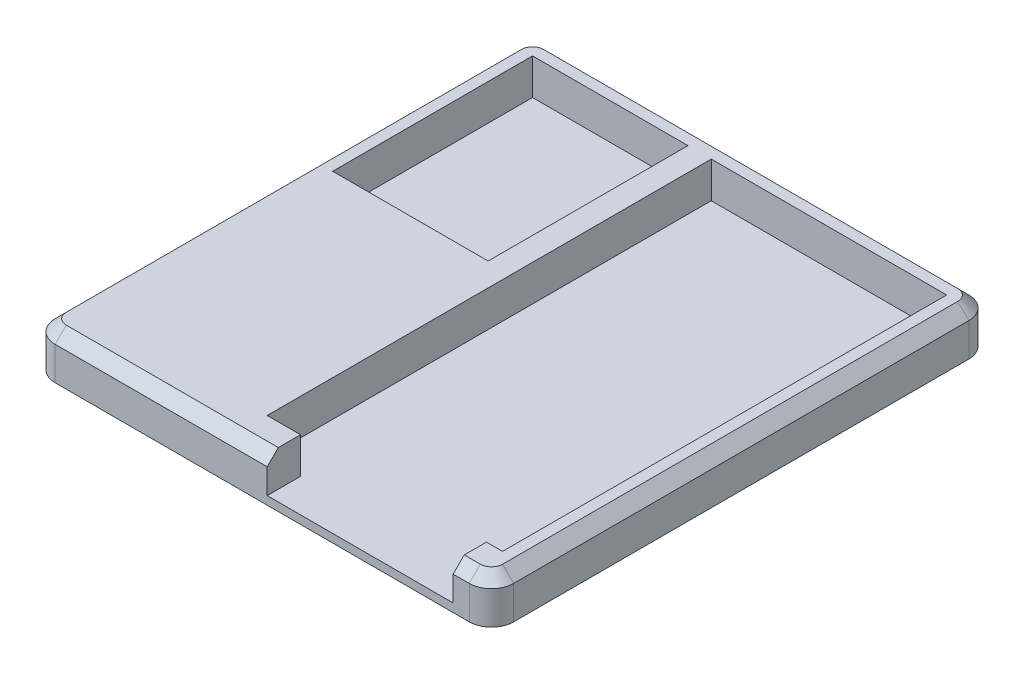
ISO-10303-21;
HEADER;
FILE_DESCRIPTION(('STEP AP214'),'2;1');
FILE_NAME('part.step','',(''),(''),'','','');
FILE_SCHEMA(('AUTOMOTIVE_DESIGN { 1 0 10303 214 1 1 1 1 }'));
ENDSEC;
DATA;
#1=APPLICATION_CONTEXT('core data for automotive mechanical design processes');
#2=APPLICATION_PROTOCOL_DEFINITION('international standard','automotive_design',2000,#1);
#3=PRODUCT_CONTEXT('',#1,'mechanical');
#4=PRODUCT('Part','Part','',(#3));
#5=PRODUCT_RELATED_PRODUCT_CATEGORY('part','',(#4));
#6=PRODUCT_DEFINITION_FORMATION('','',#4);
#7=PRODUCT_DEFINITION_CONTEXT('part definition',#1,'design');
#8=PRODUCT_DEFINITION('design','',#6,#7);
#9=PRODUCT_DEFINITION_SHAPE('','',#8);
#10=(LENGTH_UNIT() NAMED_UNIT(*) SI_UNIT(.MILLI.,.METRE.));
#11=(NAMED_UNIT(*) PLANE_ANGLE_UNIT() SI_UNIT($,.RADIAN.));
#12=(NAMED_UNIT(*) SI_UNIT($,.STERADIAN.) SOLID_ANGLE_UNIT());
#13=UNCERTAINTY_MEASURE_WITH_UNIT(LENGTH_MEASURE(1.E-05),#10,'distance_accuracy_value','');
#14=(GEOMETRIC_REPRESENTATION_CONTEXT(3) GLOBAL_UNCERTAINTY_ASSIGNED_CONTEXT((#13)) GLOBAL_UNIT_ASSIGNED_CONTEXT((#10,
#11,#12)) REPRESENTATION_CONTEXT('',''));
#15=CARTESIAN_POINT('',(0.,0.,0.));
#16=DIRECTION('',(0.,0.,1.));
#17=DIRECTION('',(1.,0.,0.));
#18=AXIS2_PLACEMENT_3D('',#15,#16,#17);
#19=CARTESIAN_POINT('',(-6.47699999999997,1.905,49.53));
#20=DIRECTION('',(0.,0.,1.));
#21=DIRECTION('',(1.,0.,0.));
#22=AXIS2_PLACEMENT_3D('',#19,#20,#21);
#23=PLANE('',#22);
#24=DIRECTION('',(1.,0.,0.));
#25=VECTOR('',#24,1.);
#26=CARTESIAN_POINT('',(-6.47699999999997,10.16,49.53));
#27=LINE('',#26,#25);
#28=CARTESIAN_POINT('',(-6.47699999999997,10.16,49.53));
#29=VERTEX_POINT('',#28);
#30=CARTESIAN_POINT('',(1.14300000000002,10.16,49.53));
#31=VERTEX_POINT('',#30);
#32=EDGE_CURVE('E251',#29,#31,#27,.T.);
#33=ORIENTED_EDGE('',*,*,#32,.T.);
#34=DIRECTION('',(0.,1.,0.));
#35=VECTOR('',#34,1.);
#36=CARTESIAN_POINT('',(1.14300000000002,1.905,49.53));
#37=LINE('',#36,#35);
#38=CARTESIAN_POINT('',(1.14300000000002,1.905,49.53));
#39=VERTEX_POINT('',#38);
#40=EDGE_CURVE('E241',#39,#31,#37,.T.);
#41=ORIENTED_EDGE('',*,*,#40,.F.);
#42=DIRECTION('',(1.,0.,0.));
#43=VECTOR('',#42,1.);
#44=CARTESIAN_POINT('',(-6.47699999999997,1.905,49.53));
#45=LINE('',#44,#43);
#46=CARTESIAN_POINT('',(-6.47699999999997,1.905,49.53));
#47=VERTEX_POINT('',#46);
#48=EDGE_CURVE('E228',#47,#39,#45,.T.);
#49=ORIENTED_EDGE('',*,*,#48,.F.);
#50=DIRECTION('',(0.,1.,0.));
#51=VECTOR('',#50,1.);
#52=CARTESIAN_POINT('',(-6.47699999999997,1.905,49.53));
#53=LINE('',#52,#51);
#54=EDGE_CURVE('E273',#47,#29,#53,.T.);
#55=ORIENTED_EDGE('',*,*,#54,.T.);
#56=EDGE_LOOP('',(#33,#41,#49,#55));
#57=FACE_BOUND('',#56,.T.);
#58=ADVANCED_FACE('F38',(#57),#23,.F.);
#59=CARTESIAN_POINT('',(-52.451,10.16,-57.15));
#60=DIRECTION('',(1.,0.,0.));
#61=DIRECTION('',(0.,0.,-1.));
#62=AXIS2_PLACEMENT_3D('',#59,#60,#61);
#63=PLANE('',#62);
#64=DIRECTION('',(0.,-1.,0.));
#65=VECTOR('',#64,1.);
#66=CARTESIAN_POINT('',(-52.451,10.16,52.07));
#67=LINE('',#66,#65);
#68=CARTESIAN_POINT('',(-52.451,0.,52.07));
#69=VERTEX_POINT('',#68);
#70=CARTESIAN_POINT('',(-52.451,7.62,52.07));
#71=VERTEX_POINT('',#70);
#72=EDGE_CURVE('E341',#69,#71,#67,.F.);
#73=ORIENTED_EDGE('',*,*,#72,.T.);
#74=DIRECTION('',(0.,0.,-1.));
#75=VECTOR('',#74,1.);
#76=CARTESIAN_POINT('',(-52.451,7.62,-57.15));
#77=LINE('',#76,#75);
#78=CARTESIAN_POINT('',(-52.451,7.62,-52.07));
#79=VERTEX_POINT('',#78);
#80=EDGE_CURVE('E11',#71,#79,#77,.T.);
#81=ORIENTED_EDGE('',*,*,#80,.T.);
#82=DIRECTION('',(0.,-1.,0.));
#83=VECTOR('',#82,1.);
#84=CARTESIAN_POINT('',(-52.451,10.16,-52.07));
#85=LINE('',#84,#83);
#86=CARTESIAN_POINT('',(-52.451,0.,-52.07));
#87=VERTEX_POINT('',#86);
#88=EDGE_CURVE('E339',#79,#87,#85,.T.);
#89=ORIENTED_EDGE('',*,*,#88,.T.);
#90=DIRECTION('',(0.,0.,1.));
#91=VECTOR('',#90,1.);
#92=CARTESIAN_POINT('',(-52.451,0.,-57.15));
#93=LINE('',#92,#91);
#94=EDGE_CURVE('E304',#87,#69,#93,.T.);
#95=ORIENTED_EDGE('',*,*,#94,.T.);
#96=EDGE_LOOP('',(#73,#81,#89,#95));
#97=FACE_BOUND('',#96,.T.);
#98=ADVANCED_FACE('F500',(#97),#63,.F.);
#99=CARTESIAN_POINT('',(52.451,10.16,57.15));
#100=DIRECTION('',(0.,0.,-1.));
#101=DIRECTION('',(-1.,0.,0.));
#102=AXIS2_PLACEMENT_3D('',#99,#100,#101);
#103=PLANE('',#102);
#104=DIRECTION('',(0.,-1.,0.));
#105=VECTOR('',#104,1.);
#106=CARTESIAN_POINT('',(47.371,10.16,57.15));
#107=LINE('',#106,#105);
#108=CARTESIAN_POINT('',(47.371,0.,57.15));
#109=VERTEX_POINT('',#108);
#110=CARTESIAN_POINT('',(47.371,7.62,57.15));
#111=VERTEX_POINT('',#110);
#112=EDGE_CURVE('E337',#109,#111,#107,.F.);
#113=ORIENTED_EDGE('',*,*,#112,.T.);
#114=DIRECTION('',(-1.,0.,0.));
#115=VECTOR('',#114,1.);
#116=CARTESIAN_POINT('',(52.451,7.62,57.15));
#117=LINE('',#116,#115);
#118=CARTESIAN_POINT('',(43.688,7.62,57.15));
#119=VERTEX_POINT('',#118);
#120=EDGE_CURVE('E369',#111,#119,#117,.T.);
#121=ORIENTED_EDGE('',*,*,#120,.T.);
#122=DIRECTION('',(0.,1.,0.));
#123=VECTOR('',#122,1.);
#124=CARTESIAN_POINT('',(43.688,1.905,57.15));
#125=LINE('',#124,#123);
#126=CARTESIAN_POINT('',(43.688,1.905,57.15));
#127=VERTEX_POINT('',#126);
#128=EDGE_CURVE('E217',#127,#119,#125,.T.);
#129=ORIENTED_EDGE('',*,*,#128,.F.);
#130=DIRECTION('',(1.,0.,0.));
#131=VECTOR('',#130,1.);
#132=CARTESIAN_POINT('',(1.14300000000002,1.905,57.15));
#133=LINE('',#132,#131);
#134=CARTESIAN_POINT('',(1.14300000000002,1.905,57.15));
#135=VERTEX_POINT('',#134);
#136=EDGE_CURVE('E224',#135,#127,#133,.T.);
#137=ORIENTED_EDGE('',*,*,#136,.F.);
#138=DIRECTION('',(0.,1.,0.));
#139=VECTOR('',#138,1.);
#140=CARTESIAN_POINT('',(1.14300000000002,1.905,57.15));
#141=LINE('',#140,#139);
#142=CARTESIAN_POINT('',(1.14300000000002,7.62,57.15));
#143=VERTEX_POINT('',#142);
#144=EDGE_CURVE('E206',#135,#143,#141,.T.);
#145=ORIENTED_EDGE('',*,*,#144,.T.);
#146=DIRECTION('',(-1.,0.,0.));
#147=VECTOR('',#146,1.);
#148=CARTESIAN_POINT('',(52.451,7.62,57.15));
#149=LINE('',#148,#147);
#150=CARTESIAN_POINT('',(-47.371,7.62,57.15));
#151=VERTEX_POINT('',#150);
#152=EDGE_CURVE('E367',#143,#151,#149,.T.);
#153=ORIENTED_EDGE('',*,*,#152,.T.);
#154=DIRECTION('',(0.,-1.,0.));
#155=VECTOR('',#154,1.);
#156=CARTESIAN_POINT('',(-47.371,10.16,57.15));
#157=LINE('',#156,#155);
#158=CARTESIAN_POINT('',(-47.371,0.,57.15));
#159=VERTEX_POINT('',#158);
#160=EDGE_CURVE('E335',#151,#159,#157,.T.);
#161=ORIENTED_EDGE('',*,*,#160,.T.);
#162=DIRECTION('',(1.,0.,0.));
#163=VECTOR('',#162,1.);
#164=CARTESIAN_POINT('',(52.451,0.,57.15));
#165=LINE('',#164,#163);
#166=EDGE_CURVE('E313',#159,#109,#165,.T.);
#167=ORIENTED_EDGE('',*,*,#166,.T.);
#168=EDGE_LOOP('',(#113,#121,#129,#137,#145,#153,#161,#167));
#169=FACE_BOUND('',#168,.T.);
#170=ADVANCED_FACE('F233',(#169),#103,.F.);
#171=CARTESIAN_POINT('',(52.451,10.16,-57.15));
#172=DIRECTION('',(-1.,0.,0.));
#173=DIRECTION('',(0.,0.,1.));
#174=AXIS2_PLACEMENT_3D('',#171,#172,#173);
#175=PLANE('',#174);
#176=DIRECTION('',(0.,-1.,0.));
#177=VECTOR('',#176,1.);
#178=CARTESIAN_POINT('',(52.451,10.16,-52.07));
#179=LINE('',#178,#177);
#180=CARTESIAN_POINT('',(52.451,0.,-52.07));
#181=VERTEX_POINT('',#180);
#182=CARTESIAN_POINT('',(52.451,7.62,-52.07));
#183=VERTEX_POINT('',#182);
#184=EDGE_CURVE('E322',#181,#183,#179,.F.);
#185=ORIENTED_EDGE('',*,*,#184,.T.);
#186=DIRECTION('',(0.,0.,1.));
#187=VECTOR('',#186,1.);
#188=CARTESIAN_POINT('',(52.451,7.62,-57.15));
#189=LINE('',#188,#187);
#190=CARTESIAN_POINT('',(52.451,7.62,52.07));
#191=VERTEX_POINT('',#190);
#192=EDGE_CURVE('E375',#183,#191,#189,.T.);
#193=ORIENTED_EDGE('',*,*,#192,.T.);
#194=DIRECTION('',(0.,-1.,0.));
#195=VECTOR('',#194,1.);
#196=CARTESIAN_POINT('',(52.451,10.16,52.07));
#197=LINE('',#196,#195);
#198=CARTESIAN_POINT('',(52.451,0.,52.07));
#199=VERTEX_POINT('',#198);
#200=EDGE_CURVE('E325',#191,#199,#197,.T.);
#201=ORIENTED_EDGE('',*,*,#200,.T.);
#202=DIRECTION('',(0.,0.,-1.));
#203=VECTOR('',#202,1.);
#204=CARTESIAN_POINT('',(52.451,0.,-57.15));
#205=LINE('',#204,#203);
#206=EDGE_CURVE('E316',#199,#181,#205,.T.);
#207=ORIENTED_EDGE('',*,*,#206,.T.);
#208=EDGE_LOOP('',(#185,#193,#201,#207));
#209=FACE_BOUND('',#208,.T.);
#210=ADVANCED_FACE('F472',(#209),#175,.F.);
#211=CARTESIAN_POINT('',(52.451,10.16,-57.15));
#212=DIRECTION('',(0.,0.,1.));
#213=DIRECTION('',(1.,0.,0.));
#214=AXIS2_PLACEMENT_3D('',#211,#212,#213);
#215=PLANE('',#214);
#216=DIRECTION('',(0.,-1.,0.));
#217=VECTOR('',#216,1.);
#218=CARTESIAN_POINT('',(-47.371,10.16,-57.15));
#219=LINE('',#218,#217);
#220=CARTESIAN_POINT('',(-47.371,0.,-57.15));
#221=VERTEX_POINT('',#220);
#222=CARTESIAN_POINT('',(-47.371,7.62,-57.15));
#223=VERTEX_POINT('',#222);
#224=EDGE_CURVE('E345',#221,#223,#219,.F.);
#225=ORIENTED_EDGE('',*,*,#224,.T.);
#226=DIRECTION('',(1.,0.,0.));
#227=VECTOR('',#226,1.);
#228=CARTESIAN_POINT('',(52.451,7.62,-57.15));
#229=LINE('',#228,#227);
#230=CARTESIAN_POINT('',(47.371,7.62,-57.15));
#231=VERTEX_POINT('',#230);
#232=EDGE_CURVE('E379',#223,#231,#229,.T.);
#233=ORIENTED_EDGE('',*,*,#232,.T.);
#234=DIRECTION('',(0.,-1.,0.));
#235=VECTOR('',#234,1.);
#236=CARTESIAN_POINT('',(47.371,10.16,-57.15));
#237=LINE('',#236,#235);
#238=CARTESIAN_POINT('',(47.371,0.,-57.15));
#239=VERTEX_POINT('',#238);
#240=EDGE_CURVE('E343',#231,#239,#237,.T.);
#241=ORIENTED_EDGE('',*,*,#240,.T.);
#242=DIRECTION('',(-1.,0.,0.));
#243=VECTOR('',#242,1.);
#244=CARTESIAN_POINT('',(52.451,0.,-57.15));
#245=LINE('',#244,#243);
#246=EDGE_CURVE('E319',#239,#221,#245,.T.);
#247=ORIENTED_EDGE('',*,*,#246,.T.);
#248=EDGE_LOOP('',(#225,#233,#241,#247));
#249=FACE_BOUND('',#248,.T.);
#250=ADVANCED_FACE('F540',(#249),#215,.F.);
#251=CARTESIAN_POINT('',(0.,10.16,0.));
#252=DIRECTION('',(0.,-1.,0.));
#253=DIRECTION('',(0.,0.,-1.));
#254=AXIS2_PLACEMENT_3D('',#251,#252,#253);
#255=PLANE('',#254);
#256=DIRECTION('',(0.,0.,-1.));
#257=VECTOR('',#256,1.);
#258=CARTESIAN_POINT('',(43.688,10.16,49.53));
#259=LINE('',#258,#257);
#260=CARTESIAN_POINT('',(43.688,10.16,54.61));
#261=VERTEX_POINT('',#260);
#262=CARTESIAN_POINT('',(43.688,10.16,49.53));
#263=VERTEX_POINT('',#262);
#264=EDGE_CURVE('E229',#261,#263,#259,.T.);
#265=ORIENTED_EDGE('',*,*,#264,.F.);
#266=DIRECTION('',(1.,0.,0.));
#267=VECTOR('',#266,1.);
#268=CARTESIAN_POINT('',(0.,10.16,54.61));
#269=LINE('',#268,#267);
#270=CARTESIAN_POINT('',(47.371,10.16,54.61));
#271=VERTEX_POINT('',#270);
#272=EDGE_CURVE('E364',#261,#271,#269,.T.);
#273=ORIENTED_EDGE('',*,*,#272,.T.);
#274=CARTESIAN_POINT('',(47.371,10.16,52.07));
#275=DIRECTION('',(0.,-1.,0.));
#276=DIRECTION('',(0.,0.,-1.));
#277=AXIS2_PLACEMENT_3D('',#274,#275,#276);
#278=CIRCLE('',#277,2.54000000000003);
#279=CARTESIAN_POINT('',(49.911,10.16,52.07));
#280=VERTEX_POINT('',#279);
#281=EDGE_CURVE('E362',#271,#280,#278,.F.);
#282=ORIENTED_EDGE('',*,*,#281,.T.);
#283=DIRECTION('',(0.,0.,-1.));
#284=VECTOR('',#283,1.);
#285=CARTESIAN_POINT('',(49.911,10.16,0.));
#286=LINE('',#285,#284);
#287=CARTESIAN_POINT('',(49.911,10.16,-52.07));
#288=VERTEX_POINT('',#287);
#289=EDGE_CURVE('E360',#280,#288,#286,.T.);
#290=ORIENTED_EDGE('',*,*,#289,.T.);
#291=CARTESIAN_POINT('',(47.371,10.16,-52.07));
#292=DIRECTION('',(0.,-1.,0.));
#293=DIRECTION('',(0.,0.,-1.));
#294=AXIS2_PLACEMENT_3D('',#291,#292,#293);
#295=CIRCLE('',#294,2.54000000000003);
#296=CARTESIAN_POINT('',(47.371,10.16,-54.61));
#297=VERTEX_POINT('',#296);
#298=EDGE_CURVE('E358',#288,#297,#295,.F.);
#299=ORIENTED_EDGE('',*,*,#298,.T.);
#300=DIRECTION('',(-1.,0.,0.));
#301=VECTOR('',#300,1.);
#302=CARTESIAN_POINT('',(0.,10.16,-54.61));
#303=LINE('',#302,#301);
#304=CARTESIAN_POINT('',(-47.371,10.16,-54.61));
#305=VERTEX_POINT('',#304);
#306=EDGE_CURVE('E356',#297,#305,#303,.T.);
#307=ORIENTED_EDGE('',*,*,#306,.T.);
#308=CARTESIAN_POINT('',(-47.371,10.16,-52.07));
#309=DIRECTION('',(0.,-1.,0.));
#310=DIRECTION('',(0.,0.,-1.));
#311=AXIS2_PLACEMENT_3D('',#308,#309,#310);
#312=CIRCLE('',#311,2.54000000000003);
#313=CARTESIAN_POINT('',(-49.911,10.16,-52.07));
#314=VERTEX_POINT('',#313);
#315=EDGE_CURVE('E352',#305,#314,#312,.F.);
#316=ORIENTED_EDGE('',*,*,#315,.T.);
#317=DIRECTION('',(0.,0.,1.));
#318=VECTOR('',#317,1.);
#319=CARTESIAN_POINT('',(-49.911,10.16,0.));
#320=LINE('',#319,#318);
#321=CARTESIAN_POINT('',(-49.911,10.16,52.07));
#322=VERTEX_POINT('',#321);
#323=EDGE_CURVE('E348',#314,#322,#320,.T.);
#324=ORIENTED_EDGE('',*,*,#323,.T.);
#325=CARTESIAN_POINT('',(-47.371,10.16,52.07));
#326=DIRECTION('',(0.,-1.,0.));
#327=DIRECTION('',(0.,0.,-1.));
#328=AXIS2_PLACEMENT_3D('',#325,#326,#327);
#329=CIRCLE('',#328,2.54000000000003);
#330=CARTESIAN_POINT('',(-47.371,10.16,54.61));
#331=VERTEX_POINT('',#330);
#332=EDGE_CURVE('E350',#322,#331,#329,.F.);
#333=ORIENTED_EDGE('',*,*,#332,.T.);
#334=DIRECTION('',(1.,0.,0.));
#335=VECTOR('',#334,1.);
#336=CARTESIAN_POINT('',(0.,10.16,54.61));
#337=LINE('',#336,#335);
#338=CARTESIAN_POINT('',(1.14300000000002,10.16,54.61));
#339=VERTEX_POINT('',#338);
#340=EDGE_CURVE('E354',#331,#339,#337,.T.);
#341=ORIENTED_EDGE('',*,*,#340,.T.);
#342=DIRECTION('',(0.,0.,1.));
#343=VECTOR('',#342,1.);
#344=CARTESIAN_POINT('',(1.14300000000002,10.16,49.53));
#345=LINE('',#344,#343);
#346=EDGE_CURVE('E238',#31,#339,#345,.T.);
#347=ORIENTED_EDGE('',*,*,#346,.F.);
#348=ORIENTED_EDGE('',*,*,#32,.F.);
#349=DIRECTION('',(0.,0.,1.));
#350=VECTOR('',#349,1.);
#351=CARTESIAN_POINT('',(-6.47699999999998,10.16,-52.07));
#352=LINE('',#351,#350);
#353=CARTESIAN_POINT('',(-6.47699999999998,10.16,-52.07));
#354=VERTEX_POINT('',#353);
#355=EDGE_CURVE('E263',#354,#29,#352,.T.);
#356=ORIENTED_EDGE('',*,*,#355,.F.);
#357=DIRECTION('',(-1.,0.,0.));
#358=VECTOR('',#357,1.);
#359=CARTESIAN_POINT('',(-6.47699999999998,10.16,-52.07));
#360=LINE('',#359,#358);
#361=CARTESIAN_POINT('',(47.371,10.16,-52.07));
#362=VERTEX_POINT('',#361);
#363=EDGE_CURVE('E260',#362,#354,#360,.T.);
#364=ORIENTED_EDGE('',*,*,#363,.F.);
#365=DIRECTION('',(0.,0.,-1.));
#366=VECTOR('',#365,1.);
#367=CARTESIAN_POINT('',(47.371,10.16,-52.07));
#368=LINE('',#367,#366);
#369=CARTESIAN_POINT('',(47.371,10.16,49.53));
#370=VERTEX_POINT('',#369);
#371=EDGE_CURVE('E243',#370,#362,#368,.T.);
#372=ORIENTED_EDGE('',*,*,#371,.F.);
#373=EDGE_CURVE('E266',#263,#370,#27,.T.);
#374=ORIENTED_EDGE('',*,*,#373,.F.);
#375=EDGE_LOOP('',(#265,#273,#282,#290,#299,#307,#316,#324,#333,#341,#347,#348,#356,#364,#372,#374));
#376=FACE_BOUND('',#375,.T.);
#377=DIRECTION('',(-1.,0.,0.));
#378=VECTOR('',#377,1.);
#379=CARTESIAN_POINT('',(-47.371,10.16,-52.07));
#380=LINE('',#379,#378);
#381=CARTESIAN_POINT('',(-11.811,10.16,-52.07));
#382=VERTEX_POINT('',#381);
#383=CARTESIAN_POINT('',(-47.371,10.16,-52.07));
#384=VERTEX_POINT('',#383);
#385=EDGE_CURVE('E294',#382,#384,#380,.T.);
#386=ORIENTED_EDGE('',*,*,#385,.F.);
#387=DIRECTION('',(0.,0.,-1.));
#388=VECTOR('',#387,1.);
#389=CARTESIAN_POINT('',(-11.811,10.16,-52.07));
#390=LINE('',#389,#388);
#391=CARTESIAN_POINT('',(-11.811,10.16,-6.35000000000002));
#392=VERTEX_POINT('',#391);
#393=EDGE_CURVE('E272',#392,#382,#390,.T.);
#394=ORIENTED_EDGE('',*,*,#393,.F.);
#395=DIRECTION('',(1.,0.,0.));
#396=VECTOR('',#395,1.);
#397=CARTESIAN_POINT('',(-47.371,10.16,-6.35000000000002));
#398=LINE('',#397,#396);
#399=CARTESIAN_POINT('',(-47.371,10.16,-6.35000000000002));
#400=VERTEX_POINT('',#399);
#401=EDGE_CURVE('E283',#400,#392,#398,.T.);
#402=ORIENTED_EDGE('',*,*,#401,.F.);
#403=DIRECTION('',(0.,0.,1.));
#404=VECTOR('',#403,1.);
#405=CARTESIAN_POINT('',(-47.371,10.16,-52.07));
#406=LINE('',#405,#404);
#407=EDGE_CURVE('E297',#384,#400,#406,.T.);
#408=ORIENTED_EDGE('',*,*,#407,.F.);
#409=EDGE_LOOP('',(#386,#394,#402,#408));
#410=FACE_BOUND('',#409,.T.);
#411=ADVANCED_FACE('F416',(#376,#410),#255,.F.);
#412=CARTESIAN_POINT('',(0.,0.,0.));
#413=DIRECTION('',(0.,-1.,0.));
#414=DIRECTION('',(0.,0.,-1.));
#415=AXIS2_PLACEMENT_3D('',#412,#413,#414);
#416=PLANE('',#415);
#417=ORIENTED_EDGE('',*,*,#206,.F.);
#418=CARTESIAN_POINT('',(47.371,0.,52.07));
#419=DIRECTION('',(0.,-1.,0.));
#420=DIRECTION('',(0.,0.,-1.));
#421=AXIS2_PLACEMENT_3D('',#418,#419,#420);
#422=CIRCLE('',#421,5.08);
#423=EDGE_CURVE('E333',#199,#109,#422,.T.);
#424=ORIENTED_EDGE('',*,*,#423,.T.);
#425=ORIENTED_EDGE('',*,*,#166,.F.);
#426=CARTESIAN_POINT('',(-47.371,0.,52.07));
#427=DIRECTION('',(0.,-1.,0.));
#428=DIRECTION('',(0.,0.,-1.));
#429=AXIS2_PLACEMENT_3D('',#426,#427,#428);
#430=CIRCLE('',#429,5.08);
#431=EDGE_CURVE('E331',#159,#69,#430,.T.);
#432=ORIENTED_EDGE('',*,*,#431,.T.);
#433=ORIENTED_EDGE('',*,*,#94,.F.);
#434=CARTESIAN_POINT('',(-47.371,0.,-52.07));
#435=DIRECTION('',(0.,-1.,0.));
#436=DIRECTION('',(0.,0.,-1.));
#437=AXIS2_PLACEMENT_3D('',#434,#435,#436);
#438=CIRCLE('',#437,5.08);
#439=EDGE_CURVE('E329',#87,#221,#438,.T.);
#440=ORIENTED_EDGE('',*,*,#439,.T.);
#441=ORIENTED_EDGE('',*,*,#246,.F.);
#442=CARTESIAN_POINT('',(47.371,0.,-52.07));
#443=DIRECTION('',(0.,-1.,0.));
#444=DIRECTION('',(0.,0.,-1.));
#445=AXIS2_PLACEMENT_3D('',#442,#443,#444);
#446=CIRCLE('',#445,5.08);
#447=EDGE_CURVE('E327',#239,#181,#446,.T.);
#448=ORIENTED_EDGE('',*,*,#447,.T.);
#449=EDGE_LOOP('',(#417,#424,#425,#432,#433,#440,#441,#448));
#450=FACE_BOUND('',#449,.T.);
#451=ADVANCED_FACE('F466',(#450),#416,.T.);
#452=CARTESIAN_POINT('',(-11.811,1.905,-52.07));
#453=DIRECTION('',(1.,0.,0.));
#454=DIRECTION('',(0.,0.,-1.));
#455=AXIS2_PLACEMENT_3D('',#452,#453,#454);
#456=PLANE('',#455);
#457=ORIENTED_EDGE('',*,*,#393,.T.);
#458=DIRECTION('',(0.,1.,0.));
#459=VECTOR('',#458,1.);
#460=CARTESIAN_POINT('',(-11.811,1.905,-52.07));
#461=LINE('',#460,#459);
#462=CARTESIAN_POINT('',(-11.811,1.905,-52.07));
#463=VERTEX_POINT('',#462);
#464=EDGE_CURVE('E292',#463,#382,#461,.T.);
#465=ORIENTED_EDGE('',*,*,#464,.F.);
#466=DIRECTION('',(0.,0.,-1.));
#467=VECTOR('',#466,1.);
#468=CARTESIAN_POINT('',(-11.811,1.905,-52.07));
#469=LINE('',#468,#467);
#470=CARTESIAN_POINT('',(-11.811,1.905,-6.35000000000002));
#471=VERTEX_POINT('',#470);
#472=EDGE_CURVE('E279',#471,#463,#469,.T.);
#473=ORIENTED_EDGE('',*,*,#472,.F.);
#474=DIRECTION('',(0.,1.,0.));
#475=VECTOR('',#474,1.);
#476=CARTESIAN_POINT('',(-11.811,1.905,-6.35000000000002));
#477=LINE('',#476,#475);
#478=EDGE_CURVE('E302',#471,#392,#477,.T.);
#479=ORIENTED_EDGE('',*,*,#478,.T.);
#480=EDGE_LOOP('',(#457,#465,#473,#479));
#481=FACE_BOUND('',#480,.T.);
#482=ADVANCED_FACE('F527',(#481),#456,.F.);
#483=CARTESIAN_POINT('',(-47.371,1.905,-6.35000000000002));
#484=DIRECTION('',(0.,0.,1.));
#485=DIRECTION('',(1.,0.,0.));
#486=AXIS2_PLACEMENT_3D('',#483,#484,#485);
#487=PLANE('',#486);
#488=ORIENTED_EDGE('',*,*,#401,.T.);
#489=ORIENTED_EDGE('',*,*,#478,.F.);
#490=DIRECTION('',(1.,0.,0.));
#491=VECTOR('',#490,1.);
#492=CARTESIAN_POINT('',(-47.371,1.905,-6.35000000000002));
#493=LINE('',#492,#491);
#494=CARTESIAN_POINT('',(-47.371,1.905,-6.35000000000002));
#495=VERTEX_POINT('',#494);
#496=EDGE_CURVE('E289',#495,#471,#493,.T.);
#497=ORIENTED_EDGE('',*,*,#496,.F.);
#498=DIRECTION('',(0.,1.,0.));
#499=VECTOR('',#498,1.);
#500=CARTESIAN_POINT('',(-47.371,1.905,-6.35000000000002));
#501=LINE('',#500,#499);
#502=EDGE_CURVE('E305',#495,#400,#501,.T.);
#503=ORIENTED_EDGE('',*,*,#502,.T.);
#504=EDGE_LOOP('',(#488,#489,#497,#503));
#505=FACE_BOUND('',#504,.T.);
#506=ADVANCED_FACE('F523',(#505),#487,.F.);
#507=CARTESIAN_POINT('',(-47.371,1.905,-52.07));
#508=DIRECTION('',(-1.,0.,0.));
#509=DIRECTION('',(0.,0.,1.));
#510=AXIS2_PLACEMENT_3D('',#507,#508,#509);
#511=PLANE('',#510);
#512=ORIENTED_EDGE('',*,*,#407,.T.);
#513=ORIENTED_EDGE('',*,*,#502,.F.);
#514=DIRECTION('',(0.,0.,1.));
#515=VECTOR('',#514,1.);
#516=CARTESIAN_POINT('',(-47.371,1.905,-52.07));
#517=LINE('',#516,#515);
#518=CARTESIAN_POINT('',(-47.371,1.905,-52.07));
#519=VERTEX_POINT('',#518);
#520=EDGE_CURVE('E286',#519,#495,#517,.T.);
#521=ORIENTED_EDGE('',*,*,#520,.F.);
#522=DIRECTION('',(0.,1.,0.));
#523=VECTOR('',#522,1.);
#524=CARTESIAN_POINT('',(-47.371,1.905,-52.07));
#525=LINE('',#524,#523);
#526=EDGE_CURVE('E307',#519,#384,#525,.T.);
#527=ORIENTED_EDGE('',*,*,#526,.T.);
#528=EDGE_LOOP('',(#512,#513,#521,#527));
#529=FACE_BOUND('',#528,.T.);
#530=ADVANCED_FACE('F526',(#529),#511,.F.);
#531=CARTESIAN_POINT('',(-47.371,1.905,-52.07));
#532=DIRECTION('',(0.,0.,-1.));
#533=DIRECTION('',(-1.,0.,0.));
#534=AXIS2_PLACEMENT_3D('',#531,#532,#533);
#535=PLANE('',#534);
#536=ORIENTED_EDGE('',*,*,#385,.T.);
#537=ORIENTED_EDGE('',*,*,#526,.F.);
#538=DIRECTION('',(-1.,0.,0.));
#539=VECTOR('',#538,1.);
#540=CARTESIAN_POINT('',(-47.371,1.905,-52.07));
#541=LINE('',#540,#539);
#542=EDGE_CURVE('E282',#463,#519,#541,.T.);
#543=ORIENTED_EDGE('',*,*,#542,.F.);
#544=ORIENTED_EDGE('',*,*,#464,.T.);
#545=EDGE_LOOP('',(#536,#537,#543,#544));
#546=FACE_BOUND('',#545,.T.);
#547=ADVANCED_FACE('F518',(#546),#535,.F.);
#548=CARTESIAN_POINT('',(0.,1.905,0.));
#549=DIRECTION('',(0.,1.,0.));
#550=DIRECTION('',(0.,0.,1.));
#551=AXIS2_PLACEMENT_3D('',#548,#549,#550);
#552=PLANE('',#551);
#553=ORIENTED_EDGE('',*,*,#472,.T.);
#554=ORIENTED_EDGE('',*,*,#542,.T.);
#555=ORIENTED_EDGE('',*,*,#520,.T.);
#556=ORIENTED_EDGE('',*,*,#496,.T.);
#557=EDGE_LOOP('',(#553,#554,#555,#556));
#558=FACE_BOUND('',#557,.T.);
#559=ADVANCED_FACE('F513',(#558),#552,.T.);
#560=CARTESIAN_POINT('',(47.371,1.905,-52.07));
#561=DIRECTION('',(1.,0.,0.));
#562=DIRECTION('',(0.,0.,-1.));
#563=AXIS2_PLACEMENT_3D('',#560,#561,#562);
#564=PLANE('',#563);
#565=ORIENTED_EDGE('',*,*,#371,.T.);
#566=DIRECTION('',(0.,1.,0.));
#567=VECTOR('',#566,1.);
#568=CARTESIAN_POINT('',(47.371,1.905,-52.07));
#569=LINE('',#568,#567);
#570=CARTESIAN_POINT('',(47.371,1.905,-52.07));
#571=VERTEX_POINT('',#570);
#572=EDGE_CURVE('E258',#571,#362,#569,.T.);
#573=ORIENTED_EDGE('',*,*,#572,.F.);
#574=DIRECTION('',(0.,0.,-1.));
#575=VECTOR('',#574,1.);
#576=CARTESIAN_POINT('',(47.371,1.905,-52.07));
#577=LINE('',#576,#575);
#578=CARTESIAN_POINT('',(47.371,1.905,49.53));
#579=VERTEX_POINT('',#578);
#580=EDGE_CURVE('E248',#579,#571,#577,.T.);
#581=ORIENTED_EDGE('',*,*,#580,.F.);
#582=DIRECTION('',(0.,1.,0.));
#583=VECTOR('',#582,1.);
#584=CARTESIAN_POINT('',(47.371,1.905,49.53));
#585=LINE('',#584,#583);
#586=EDGE_CURVE('E269',#579,#370,#585,.T.);
#587=ORIENTED_EDGE('',*,*,#586,.T.);
#588=EDGE_LOOP('',(#565,#573,#581,#587));
#589=FACE_BOUND('',#588,.T.);
#590=ADVANCED_FACE('F431',(#589),#564,.F.);
#591=CARTESIAN_POINT('',(43.688,1.905,49.53));
#592=VERTEX_POINT('',#591);
#593=EDGE_CURVE('E256',#592,#579,#45,.T.);
#594=ORIENTED_EDGE('',*,*,#593,.F.);
#595=DIRECTION('',(0.,1.,0.));
#596=VECTOR('',#595,1.);
#597=CARTESIAN_POINT('',(43.688,1.905,49.53));
#598=LINE('',#597,#596);
#599=EDGE_CURVE('E244',#592,#263,#598,.T.);
#600=ORIENTED_EDGE('',*,*,#599,.T.);
#601=ORIENTED_EDGE('',*,*,#373,.T.);
#602=ORIENTED_EDGE('',*,*,#586,.F.);
#603=EDGE_LOOP('',(#594,#600,#601,#602));
#604=FACE_BOUND('',#603,.T.);
#605=ADVANCED_FACE('F437',(#604),#23,.F.);
#606=CARTESIAN_POINT('',(-6.47699999999998,1.905,-52.07));
#607=DIRECTION('',(-1.,0.,0.));
#608=DIRECTION('',(0.,0.,1.));
#609=AXIS2_PLACEMENT_3D('',#606,#607,#608);
#610=PLANE('',#609);
#611=ORIENTED_EDGE('',*,*,#355,.T.);
#612=ORIENTED_EDGE('',*,*,#54,.F.);
#613=DIRECTION('',(0.,0.,1.));
#614=VECTOR('',#613,1.);
#615=CARTESIAN_POINT('',(-6.47699999999998,1.905,-52.07));
#616=LINE('',#615,#614);
#617=CARTESIAN_POINT('',(-6.47699999999998,1.905,-52.07));
#618=VERTEX_POINT('',#617);
#619=EDGE_CURVE('E254',#618,#47,#616,.T.);
#620=ORIENTED_EDGE('',*,*,#619,.F.);
#621=DIRECTION('',(0.,1.,0.));
#622=VECTOR('',#621,1.);
#623=CARTESIAN_POINT('',(-6.47699999999998,1.905,-52.07));
#624=LINE('',#623,#622);
#625=EDGE_CURVE('E275',#618,#354,#624,.T.);
#626=ORIENTED_EDGE('',*,*,#625,.T.);
#627=EDGE_LOOP('',(#611,#612,#620,#626));
#628=FACE_BOUND('',#627,.T.);
#629=ADVANCED_FACE('F424',(#628),#610,.F.);
#630=CARTESIAN_POINT('',(-6.47699999999998,1.905,-52.07));
#631=DIRECTION('',(0.,0.,-1.));
#632=DIRECTION('',(-1.,0.,0.));
#633=AXIS2_PLACEMENT_3D('',#630,#631,#632);
#634=PLANE('',#633);
#635=ORIENTED_EDGE('',*,*,#363,.T.);
#636=ORIENTED_EDGE('',*,*,#625,.F.);
#637=DIRECTION('',(-1.,0.,0.));
#638=VECTOR('',#637,1.);
#639=CARTESIAN_POINT('',(-6.47699999999998,1.905,-52.07));
#640=LINE('',#639,#638);
#641=EDGE_CURVE('E250',#571,#618,#640,.T.);
#642=ORIENTED_EDGE('',*,*,#641,.F.);
#643=ORIENTED_EDGE('',*,*,#572,.T.);
#644=EDGE_LOOP('',(#635,#636,#642,#643));
#645=FACE_BOUND('',#644,.T.);
#646=ADVANCED_FACE('F428',(#645),#634,.F.);
#647=CARTESIAN_POINT('',(0.,1.905,0.));
#648=DIRECTION('',(0.,1.,0.));
#649=DIRECTION('',(0.,0.,1.));
#650=AXIS2_PLACEMENT_3D('',#647,#648,#649);
#651=PLANE('',#650);
#652=ORIENTED_EDGE('',*,*,#580,.T.);
#653=ORIENTED_EDGE('',*,*,#641,.T.);
#654=ORIENTED_EDGE('',*,*,#619,.T.);
#655=ORIENTED_EDGE('',*,*,#48,.T.);
#656=DIRECTION('',(0.,0.,1.));
#657=VECTOR('',#656,1.);
#658=CARTESIAN_POINT('',(1.14300000000002,1.905,49.53));
#659=LINE('',#658,#657);
#660=EDGE_CURVE('E210',#39,#135,#659,.T.);
#661=ORIENTED_EDGE('',*,*,#660,.T.);
#662=ORIENTED_EDGE('',*,*,#136,.T.);
#663=DIRECTION('',(0.,0.,-1.));
#664=VECTOR('',#663,1.);
#665=CARTESIAN_POINT('',(43.688,1.905,49.53));
#666=LINE('',#665,#664);
#667=EDGE_CURVE('E218',#127,#592,#666,.T.);
#668=ORIENTED_EDGE('',*,*,#667,.T.);
#669=ORIENTED_EDGE('',*,*,#593,.T.);
#670=EDGE_LOOP('',(#652,#653,#654,#655,#661,#662,#668,#669));
#671=FACE_BOUND('',#670,.T.);
#672=ADVANCED_FACE('F223',(#671),#651,.T.);
#673=CARTESIAN_POINT('',(1.14300000000002,1.905,49.53));
#674=DIRECTION('',(-1.,0.,0.));
#675=DIRECTION('',(0.,0.,1.));
#676=AXIS2_PLACEMENT_3D('',#673,#674,#675);
#677=PLANE('',#676);
#678=ORIENTED_EDGE('',*,*,#346,.T.);
#679=DIRECTION('',(0.,0.707106781186551,-0.707106781186544));
#680=VECTOR('',#679,1.);
#681=CARTESIAN_POINT('',(1.14300000000002,10.16,54.61));
#682=LINE('',#681,#680);
#683=EDGE_CURVE('E213',#339,#143,#682,.F.);
#684=ORIENTED_EDGE('',*,*,#683,.T.);
#685=ORIENTED_EDGE('',*,*,#144,.F.);
#686=ORIENTED_EDGE('',*,*,#660,.F.);
#687=ORIENTED_EDGE('',*,*,#40,.T.);
#688=EDGE_LOOP('',(#678,#684,#685,#686,#687));
#689=FACE_BOUND('',#688,.T.);
#690=ADVANCED_FACE('F209',(#689),#677,.F.);
#691=CARTESIAN_POINT('',(43.688,1.905,49.53));
#692=DIRECTION('',(1.,0.,0.));
#693=DIRECTION('',(0.,0.,-1.));
#694=AXIS2_PLACEMENT_3D('',#691,#692,#693);
#695=PLANE('',#694);
#696=ORIENTED_EDGE('',*,*,#128,.T.);
#697=DIRECTION('',(0.,-0.707106781186551,0.707106781186544));
#698=VECTOR('',#697,1.);
#699=CARTESIAN_POINT('',(43.688,10.16,54.61));
#700=LINE('',#699,#698);
#701=EDGE_CURVE('E371',#119,#261,#700,.F.);
#702=ORIENTED_EDGE('',*,*,#701,.T.);
#703=ORIENTED_EDGE('',*,*,#264,.T.);
#704=ORIENTED_EDGE('',*,*,#599,.F.);
#705=ORIENTED_EDGE('',*,*,#667,.F.);
#706=EDGE_LOOP('',(#696,#702,#703,#704,#705));
#707=FACE_BOUND('',#706,.T.);
#708=ADVANCED_FACE('F440',(#707),#695,.F.);
#709=CARTESIAN_POINT('',(47.371,10.16,52.07));
#710=DIRECTION('',(0.,-1.,0.));
#711=DIRECTION('',(0.,0.,-1.));
#712=AXIS2_PLACEMENT_3D('',#709,#710,#711);
#713=CYLINDRICAL_SURFACE('',#712,5.08);
#714=ORIENTED_EDGE('',*,*,#200,.F.);
#715=CARTESIAN_POINT('',(47.371,7.62,52.07));
#716=DIRECTION('',(0.,-1.,0.));
#717=DIRECTION('',(0.,0.,-1.));
#718=AXIS2_PLACEMENT_3D('',#715,#716,#717);
#719=CIRCLE('',#718,5.08);
#720=EDGE_CURVE('E373',#191,#111,#719,.T.);
#721=ORIENTED_EDGE('',*,*,#720,.T.);
#722=ORIENTED_EDGE('',*,*,#112,.F.);
#723=ORIENTED_EDGE('',*,*,#423,.F.);
#724=EDGE_LOOP('',(#714,#721,#722,#723));
#725=FACE_BOUND('',#724,.T.);
#726=ADVANCED_FACE('F460',(#725),#713,.T.);
#727=CARTESIAN_POINT('',(-47.371,10.16,52.07));
#728=DIRECTION('',(0.,-1.,0.));
#729=DIRECTION('',(0.,0.,-1.));
#730=AXIS2_PLACEMENT_3D('',#727,#728,#729);
#731=CYLINDRICAL_SURFACE('',#730,5.08);
#732=ORIENTED_EDGE('',*,*,#160,.F.);
#733=CARTESIAN_POINT('',(-47.371,7.62,52.07));
#734=DIRECTION('',(0.,-1.,0.));
#735=DIRECTION('',(0.,0.,-1.));
#736=AXIS2_PLACEMENT_3D('',#733,#734,#735);
#737=CIRCLE('',#736,5.08);
#738=EDGE_CURVE('E48',#151,#71,#737,.T.);
#739=ORIENTED_EDGE('',*,*,#738,.T.);
#740=ORIENTED_EDGE('',*,*,#72,.F.);
#741=ORIENTED_EDGE('',*,*,#431,.F.);
#742=EDGE_LOOP('',(#732,#739,#740,#741));
#743=FACE_BOUND('',#742,.T.);
#744=ADVANCED_FACE('F552',(#743),#731,.T.);
#745=CARTESIAN_POINT('',(-47.371,10.16,-52.07));
#746=DIRECTION('',(0.,-1.,0.));
#747=DIRECTION('',(0.,0.,-1.));
#748=AXIS2_PLACEMENT_3D('',#745,#746,#747);
#749=CYLINDRICAL_SURFACE('',#748,5.08);
#750=ORIENTED_EDGE('',*,*,#88,.F.);
#751=CARTESIAN_POINT('',(-47.371,7.62,-52.07));
#752=DIRECTION('',(0.,-1.,0.));
#753=DIRECTION('',(0.,0.,-1.));
#754=AXIS2_PLACEMENT_3D('',#751,#752,#753);
#755=CIRCLE('',#754,5.08);
#756=EDGE_CURVE('E382',#79,#223,#755,.T.);
#757=ORIENTED_EDGE('',*,*,#756,.T.);
#758=ORIENTED_EDGE('',*,*,#224,.F.);
#759=ORIENTED_EDGE('',*,*,#439,.F.);
#760=EDGE_LOOP('',(#750,#757,#758,#759));
#761=FACE_BOUND('',#760,.T.);
#762=ADVANCED_FACE('F555',(#761),#749,.T.);
#763=CARTESIAN_POINT('',(47.371,10.16,-52.07));
#764=DIRECTION('',(0.,-1.,0.));
#765=DIRECTION('',(0.,0.,-1.));
#766=AXIS2_PLACEMENT_3D('',#763,#764,#765);
#767=CYLINDRICAL_SURFACE('',#766,5.08);
#768=ORIENTED_EDGE('',*,*,#240,.F.);
#769=CARTESIAN_POINT('',(47.371,7.62,-52.07));
#770=DIRECTION('',(0.,-1.,0.));
#771=DIRECTION('',(0.,0.,-1.));
#772=AXIS2_PLACEMENT_3D('',#769,#770,#771);
#773=CIRCLE('',#772,5.08);
#774=EDGE_CURVE('E377',#231,#183,#773,.T.);
#775=ORIENTED_EDGE('',*,*,#774,.T.);
#776=ORIENTED_EDGE('',*,*,#184,.F.);
#777=ORIENTED_EDGE('',*,*,#447,.F.);
#778=EDGE_LOOP('',(#768,#775,#776,#777));
#779=FACE_BOUND('',#778,.T.);
#780=ADVANCED_FACE('F475',(#779),#767,.T.);
#781=CARTESIAN_POINT('',(0.,10.16,54.61));
#782=DIRECTION('',(0.,-0.707106781186544,-0.707106781186551));
#783=DIRECTION('',(1.,0.,0.));
#784=AXIS2_PLACEMENT_3D('',#781,#782,#783);
#785=PLANE('',#784);
#786=ORIENTED_EDGE('',*,*,#683,.F.);
#787=ORIENTED_EDGE('',*,*,#340,.F.);
#788=DIRECTION('',(0.,0.707106781186551,-0.707106781186544));
#789=VECTOR('',#788,1.);
#790=CARTESIAN_POINT('',(-47.371,7.62,57.15));
#791=LINE('',#790,#789);
#792=EDGE_CURVE('E43',#151,#331,#791,.T.);
#793=ORIENTED_EDGE('',*,*,#792,.F.);
#794=ORIENTED_EDGE('',*,*,#152,.F.);
#795=EDGE_LOOP('',(#786,#787,#793,#794));
#796=FACE_BOUND('',#795,.T.);
#797=ADVANCED_FACE('F41',(#796),#785,.F.);
#798=CARTESIAN_POINT('',(-47.371,10.16,52.07));
#799=DIRECTION('',(0.,-1.,0.));
#800=DIRECTION('',(0.,0.,-1.));
#801=AXIS2_PLACEMENT_3D('',#798,#799,#800);
#802=CONICAL_SURFACE('',#801,2.54000000000003,0.785398163397443);
#803=ORIENTED_EDGE('',*,*,#792,.T.);
#804=ORIENTED_EDGE('',*,*,#332,.F.);
#805=DIRECTION('',(0.707106781186544,0.707106781186551,0.));
#806=VECTOR('',#805,1.);
#807=CARTESIAN_POINT('',(-52.451,7.62,52.07));
#808=LINE('',#807,#806);
#809=EDGE_CURVE('E401',#71,#322,#808,.T.);
#810=ORIENTED_EDGE('',*,*,#809,.F.);
#811=ORIENTED_EDGE('',*,*,#738,.F.);
#812=EDGE_LOOP('',(#803,#804,#810,#811));
#813=FACE_BOUND('',#812,.T.);
#814=ADVANCED_FACE('F410',(#813),#802,.T.);
#815=CARTESIAN_POINT('',(-49.911,10.16,0.));
#816=DIRECTION('',(0.707106781186551,-0.707106781186544,0.));
#817=DIRECTION('',(0.,0.,1.));
#818=AXIS2_PLACEMENT_3D('',#815,#816,#817);
#819=PLANE('',#818);
#820=ORIENTED_EDGE('',*,*,#809,.T.);
#821=ORIENTED_EDGE('',*,*,#323,.F.);
#822=DIRECTION('',(0.707106781186544,0.707106781186552,0.));
#823=VECTOR('',#822,1.);
#824=CARTESIAN_POINT('',(-52.451,7.62,-52.07));
#825=LINE('',#824,#823);
#826=EDGE_CURVE('E399',#79,#314,#825,.T.);
#827=ORIENTED_EDGE('',*,*,#826,.F.);
#828=ORIENTED_EDGE('',*,*,#80,.F.);
#829=EDGE_LOOP('',(#820,#821,#827,#828));
#830=FACE_BOUND('',#829,.T.);
#831=ADVANCED_FACE('F490',(#830),#819,.F.);
#832=CARTESIAN_POINT('',(-47.371,10.16,-52.07));
#833=DIRECTION('',(0.,-1.,0.));
#834=DIRECTION('',(0.,0.,-1.));
#835=AXIS2_PLACEMENT_3D('',#832,#833,#834);
#836=CONICAL_SURFACE('',#835,2.54000000000003,0.785398163397443);
#837=ORIENTED_EDGE('',*,*,#826,.T.);
#838=ORIENTED_EDGE('',*,*,#315,.F.);
#839=DIRECTION('',(0.,0.707106781186551,0.707106781186544));
#840=VECTOR('',#839,1.);
#841=CARTESIAN_POINT('',(-47.371,7.62,-57.15));
#842=LINE('',#841,#840);
#843=EDGE_CURVE('E396',#223,#305,#842,.T.);
#844=ORIENTED_EDGE('',*,*,#843,.F.);
#845=ORIENTED_EDGE('',*,*,#756,.F.);
#846=EDGE_LOOP('',(#837,#838,#844,#845));
#847=FACE_BOUND('',#846,.T.);
#848=ADVANCED_FACE('F488',(#847),#836,.T.);
#849=CARTESIAN_POINT('',(0.,10.16,-54.61));
#850=DIRECTION('',(0.,-0.707106781186544,0.707106781186551));
#851=DIRECTION('',(-1.,0.,0.));
#852=AXIS2_PLACEMENT_3D('',#849,#850,#851);
#853=PLANE('',#852);
#854=ORIENTED_EDGE('',*,*,#843,.T.);
#855=ORIENTED_EDGE('',*,*,#306,.F.);
#856=DIRECTION('',(0.,0.707106781186551,0.707106781186544));
#857=VECTOR('',#856,1.);
#858=CARTESIAN_POINT('',(47.371,7.62,-57.15));
#859=LINE('',#858,#857);
#860=EDGE_CURVE('E393',#231,#297,#859,.T.);
#861=ORIENTED_EDGE('',*,*,#860,.F.);
#862=ORIENTED_EDGE('',*,*,#232,.F.);
#863=EDGE_LOOP('',(#854,#855,#861,#862));
#864=FACE_BOUND('',#863,.T.);
#865=ADVANCED_FACE('F483',(#864),#853,.F.);
#866=CARTESIAN_POINT('',(47.371,10.16,-52.07));
#867=DIRECTION('',(0.,-1.,0.));
#868=DIRECTION('',(0.,0.,-1.));
#869=AXIS2_PLACEMENT_3D('',#866,#867,#868);
#870=CONICAL_SURFACE('',#869,2.54000000000003,0.785398163397443);
#871=ORIENTED_EDGE('',*,*,#860,.T.);
#872=ORIENTED_EDGE('',*,*,#298,.F.);
#873=DIRECTION('',(-0.707106781186544,0.707106781186551,0.));
#874=VECTOR('',#873,1.);
#875=CARTESIAN_POINT('',(52.451,7.62,-52.07));
#876=LINE('',#875,#874);
#877=EDGE_CURVE('E390',#183,#288,#876,.T.);
#878=ORIENTED_EDGE('',*,*,#877,.F.);
#879=ORIENTED_EDGE('',*,*,#774,.F.);
#880=EDGE_LOOP('',(#871,#872,#878,#879));
#881=FACE_BOUND('',#880,.T.);
#882=ADVANCED_FACE('F479',(#881),#870,.T.);
#883=CARTESIAN_POINT('',(49.911,10.16,0.));
#884=DIRECTION('',(-0.707106781186551,-0.707106781186544,0.));
#885=DIRECTION('',(0.,0.,-1.));
#886=AXIS2_PLACEMENT_3D('',#883,#884,#885);
#887=PLANE('',#886);
#888=ORIENTED_EDGE('',*,*,#877,.T.);
#889=ORIENTED_EDGE('',*,*,#289,.F.);
#890=DIRECTION('',(-0.707106781186544,0.707106781186552,0.));
#891=VECTOR('',#890,1.);
#892=CARTESIAN_POINT('',(52.451,7.62,52.07));
#893=LINE('',#892,#891);
#894=EDGE_CURVE('E387',#191,#280,#893,.T.);
#895=ORIENTED_EDGE('',*,*,#894,.F.);
#896=ORIENTED_EDGE('',*,*,#192,.F.);
#897=EDGE_LOOP('',(#888,#889,#895,#896));
#898=FACE_BOUND('',#897,.T.);
#899=ADVANCED_FACE('F452',(#898),#887,.F.);
#900=CARTESIAN_POINT('',(47.371,10.16,52.07));
#901=DIRECTION('',(0.,-1.,0.));
#902=DIRECTION('',(0.,0.,-1.));
#903=AXIS2_PLACEMENT_3D('',#900,#901,#902);
#904=CONICAL_SURFACE('',#903,2.54000000000003,0.785398163397443);
#905=ORIENTED_EDGE('',*,*,#894,.T.);
#906=ORIENTED_EDGE('',*,*,#281,.F.);
#907=DIRECTION('',(0.,0.707106781186551,-0.707106781186544));
#908=VECTOR('',#907,1.);
#909=CARTESIAN_POINT('',(47.371,7.62,57.15));
#910=LINE('',#909,#908);
#911=EDGE_CURVE('E385',#111,#271,#910,.T.);
#912=ORIENTED_EDGE('',*,*,#911,.F.);
#913=ORIENTED_EDGE('',*,*,#720,.F.);
#914=EDGE_LOOP('',(#905,#906,#912,#913));
#915=FACE_BOUND('',#914,.T.);
#916=ADVANCED_FACE('F456',(#915),#904,.T.);
#917=CARTESIAN_POINT('',(0.,10.16,54.61));
#918=DIRECTION('',(0.,-0.707106781186544,-0.707106781186551));
#919=DIRECTION('',(1.,0.,0.));
#920=AXIS2_PLACEMENT_3D('',#917,#918,#919);
#921=PLANE('',#920);
#922=ORIENTED_EDGE('',*,*,#701,.F.);
#923=ORIENTED_EDGE('',*,*,#120,.F.);
#924=ORIENTED_EDGE('',*,*,#911,.T.);
#925=ORIENTED_EDGE('',*,*,#272,.F.);
#926=EDGE_LOOP('',(#922,#923,#924,#925));
#927=FACE_BOUND('',#926,.T.);
#928=ADVANCED_FACE('F444',(#927),#921,.F.);
#929=CLOSED_SHELL('',(#58,#98,#170,#210,#250,#411,#451,#482,#506,#530,#547,#559,#590,#605,#629,
#646,#672,#690,#708,#726,#744,#762,#780,#797,#814,#831,#848,#865,#882,#899,#916,#928));
#930=MANIFOLD_SOLID_BREP('B2',#929);
#931=ADVANCED_BREP_SHAPE_REPRESENTATION('',(#18,#930),#14);
#932=SHAPE_DEFINITION_REPRESENTATION(#9,#931);
ENDSEC;
END-ISO-10303-21;
